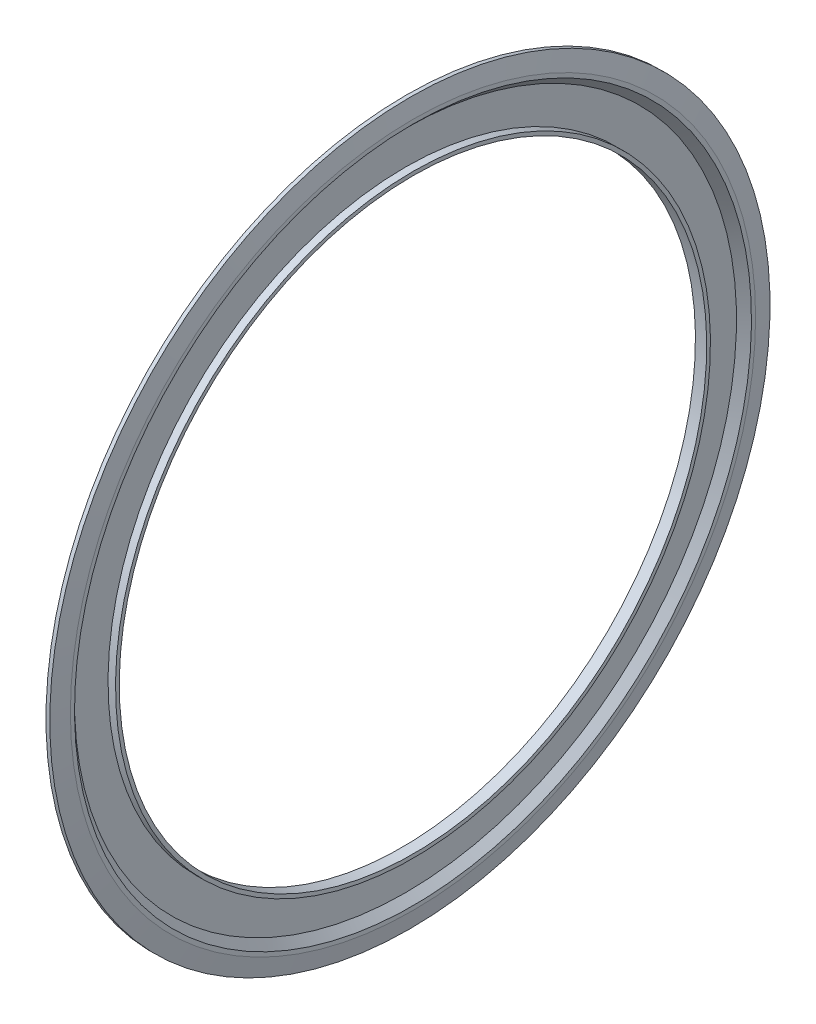
ISO-10303-21;
HEADER;
FILE_DESCRIPTION(('STEP AP214'),'2;1');
FILE_NAME('part.step','',(''),(''),'','','');
FILE_SCHEMA(('AUTOMOTIVE_DESIGN { 1 0 10303 214 1 1 1 1 }'));
ENDSEC;
DATA;
#1=APPLICATION_CONTEXT('core data for automotive mechanical design processes');
#2=APPLICATION_PROTOCOL_DEFINITION('international standard','automotive_design',2000,#1);
#3=PRODUCT_CONTEXT('',#1,'mechanical');
#4=PRODUCT('Part','Part','',(#3));
#5=PRODUCT_RELATED_PRODUCT_CATEGORY('part','',(#4));
#6=PRODUCT_DEFINITION_FORMATION('','',#4);
#7=PRODUCT_DEFINITION_CONTEXT('part definition',#1,'design');
#8=PRODUCT_DEFINITION('design','',#6,#7);
#9=PRODUCT_DEFINITION_SHAPE('','',#8);
#10=(LENGTH_UNIT() NAMED_UNIT(*) SI_UNIT(.MILLI.,.METRE.));
#11=(NAMED_UNIT(*) PLANE_ANGLE_UNIT() SI_UNIT($,.RADIAN.));
#12=(NAMED_UNIT(*) SI_UNIT($,.STERADIAN.) SOLID_ANGLE_UNIT());
#13=UNCERTAINTY_MEASURE_WITH_UNIT(LENGTH_MEASURE(1.E-05),#10,'distance_accuracy_value','');
#14=(GEOMETRIC_REPRESENTATION_CONTEXT(3) GLOBAL_UNCERTAINTY_ASSIGNED_CONTEXT((#13)) GLOBAL_UNIT_ASSIGNED_CONTEXT((#10,
#11,#12)) REPRESENTATION_CONTEXT('',''));
#15=CARTESIAN_POINT('',(0.,0.,0.));
#16=DIRECTION('',(0.,0.,1.));
#17=DIRECTION('',(1.,0.,0.));
#18=AXIS2_PLACEMENT_3D('',#15,#16,#17);
#19=CARTESIAN_POINT('',(0.498800475508444,11.58,0.));
#20=DIRECTION('',(1.,0.,0.));
#21=DIRECTION('',(0.,-1.,0.));
#22=AXIS2_PLACEMENT_3D('',#19,#20,#21);
#23=PLANE('',#22);
#24=CARTESIAN_POINT('',(0.498800475508444,0.,0.));
#25=DIRECTION('',(-1.,0.,0.));
#26=DIRECTION('',(0.,1.,0.));
#27=AXIS2_PLACEMENT_3D('',#24,#25,#26);
#28=CIRCLE('',#27,11.51);
#29=CARTESIAN_POINT('',(0.498800475508444,11.51,0.));
#30=VERTEX_POINT('',#29);
#31=EDGE_CURVE('E11',#30,#30,#28,.T.);
#32=ORIENTED_EDGE('',*,*,#31,.T.);
#33=EDGE_LOOP('',(#32));
#34=FACE_BOUND('',#33,.T.);
#35=CARTESIAN_POINT('',(0.498800475508444,0.,0.));
#36=DIRECTION('',(-1.,0.,0.));
#37=DIRECTION('',(0.,1.,0.));
#38=AXIS2_PLACEMENT_3D('',#35,#36,#37);
#39=CIRCLE('',#38,11.65);
#40=CARTESIAN_POINT('',(0.498800475508444,11.65,0.));
#41=VERTEX_POINT('',#40);
#42=EDGE_CURVE('E20',#41,#41,#39,.T.);
#43=ORIENTED_EDGE('',*,*,#42,.F.);
#44=EDGE_LOOP('',(#43));
#45=FACE_BOUND('',#44,.T.);
#46=ADVANCED_FACE('F16',(#34,#45),#23,.T.);
#47=CARTESIAN_POINT('',(0.371300475508445,0.,0.));
#48=DIRECTION('',(1.,0.,0.));
#49=DIRECTION('',(0.,1.,0.));
#50=AXIS2_PLACEMENT_3D('',#47,#48,#49);
#51=CONICAL_SURFACE('',#50,11.3825,0.785398163397446);
#52=CARTESIAN_POINT('',(0.243800475508445,0.,0.));
#53=DIRECTION('',(-1.,0.,0.));
#54=DIRECTION('',(0.,1.,0.));
#55=AXIS2_PLACEMENT_3D('',#52,#53,#54);
#56=CIRCLE('',#55,11.255);
#57=CARTESIAN_POINT('',(0.243800475508445,11.255,0.));
#58=VERTEX_POINT('',#57);
#59=EDGE_CURVE('E26',#58,#58,#56,.T.);
#60=ORIENTED_EDGE('',*,*,#59,.T.);
#61=EDGE_LOOP('',(#60));
#62=FACE_BOUND('',#61,.T.);
#63=ORIENTED_EDGE('',*,*,#31,.F.);
#64=EDGE_LOOP('',(#63));
#65=FACE_BOUND('',#64,.T.);
#66=ADVANCED_FACE('F18',(#62,#65),#51,.F.);
#67=CARTESIAN_POINT('',(0.243800475508445,10.685,0.));
#68=DIRECTION('',(1.,0.,0.));
#69=DIRECTION('',(0.,-1.,0.));
#70=AXIS2_PLACEMENT_3D('',#67,#68,#69);
#71=PLANE('',#70);
#72=CARTESIAN_POINT('',(0.243800475508445,0.,0.));
#73=DIRECTION('',(-1.,0.,0.));
#74=DIRECTION('',(0.,1.,0.));
#75=AXIS2_PLACEMENT_3D('',#72,#73,#74);
#76=CIRCLE('',#75,10.115);
#77=CARTESIAN_POINT('',(0.243800475508445,10.115,0.));
#78=VERTEX_POINT('',#77);
#79=EDGE_CURVE('E78',#78,#78,#76,.T.);
#80=ORIENTED_EDGE('',*,*,#79,.T.);
#81=EDGE_LOOP('',(#80));
#82=FACE_BOUND('',#81,.T.);
#83=ORIENTED_EDGE('',*,*,#59,.F.);
#84=EDGE_LOOP('',(#83));
#85=FACE_BOUND('',#84,.T.);
#86=ADVANCED_FACE('F99',(#82,#85),#71,.T.);
#87=CARTESIAN_POINT('',(0.371300475508445,0.,0.));
#88=DIRECTION('',(1.,0.,0.));
#89=DIRECTION('',(0.,1.,0.));
#90=AXIS2_PLACEMENT_3D('',#87,#88,#89);
#91=CYLINDRICAL_SURFACE('',#90,10.115);
#92=CARTESIAN_POINT('',(0.498800475508444,0.,0.));
#93=DIRECTION('',(-1.,0.,0.));
#94=DIRECTION('',(0.,1.,0.));
#95=AXIS2_PLACEMENT_3D('',#92,#93,#94);
#96=CIRCLE('',#95,10.115);
#97=CARTESIAN_POINT('',(0.498800475508444,10.115,0.));
#98=VERTEX_POINT('',#97);
#99=EDGE_CURVE('E75',#98,#98,#96,.T.);
#100=ORIENTED_EDGE('',*,*,#99,.T.);
#101=EDGE_LOOP('',(#100));
#102=FACE_BOUND('',#101,.T.);
#103=ORIENTED_EDGE('',*,*,#79,.F.);
#104=EDGE_LOOP('',(#103));
#105=FACE_BOUND('',#104,.T.);
#106=ADVANCED_FACE('F115',(#102,#105),#91,.T.);
#107=CARTESIAN_POINT('',(0.498800475508444,10.05125,0.));
#108=DIRECTION('',(1.,0.,0.));
#109=DIRECTION('',(0.,-1.,0.));
#110=AXIS2_PLACEMENT_3D('',#107,#108,#109);
#111=PLANE('',#110);
#112=CARTESIAN_POINT('',(0.498800475508444,0.,0.));
#113=DIRECTION('',(-1.,0.,0.));
#114=DIRECTION('',(0.,1.,0.));
#115=AXIS2_PLACEMENT_3D('',#112,#113,#114);
#116=CIRCLE('',#115,9.9875);
#117=CARTESIAN_POINT('',(0.498800475508444,9.9875,0.));
#118=VERTEX_POINT('',#117);
#119=EDGE_CURVE('E73',#118,#118,#116,.T.);
#120=ORIENTED_EDGE('',*,*,#119,.T.);
#121=EDGE_LOOP('',(#120));
#122=FACE_BOUND('',#121,.T.);
#123=ORIENTED_EDGE('',*,*,#99,.F.);
#124=EDGE_LOOP('',(#123));
#125=FACE_BOUND('',#124,.T.);
#126=ADVANCED_FACE('F123',(#122,#125),#111,.T.);
#127=CARTESIAN_POINT('',(0.307550475508445,0.,0.));
#128=DIRECTION('',(1.,0.,0.));
#129=DIRECTION('',(0.,1.,0.));
#130=AXIS2_PLACEMENT_3D('',#127,#128,#129);
#131=CYLINDRICAL_SURFACE('',#130,9.9875);
#132=CARTESIAN_POINT('',(0.116300475508445,0.,0.));
#133=DIRECTION('',(-1.,0.,0.));
#134=DIRECTION('',(0.,1.,0.));
#135=AXIS2_PLACEMENT_3D('',#132,#133,#134);
#136=CIRCLE('',#135,9.9875);
#137=CARTESIAN_POINT('',(0.116300475508445,9.9875,0.));
#138=VERTEX_POINT('',#137);
#139=EDGE_CURVE('E71',#138,#138,#136,.T.);
#140=ORIENTED_EDGE('',*,*,#139,.T.);
#141=EDGE_LOOP('',(#140));
#142=FACE_BOUND('',#141,.T.);
#143=ORIENTED_EDGE('',*,*,#119,.F.);
#144=EDGE_LOOP('',(#143));
#145=FACE_BOUND('',#144,.T.);
#146=ADVANCED_FACE('F118',(#142,#145),#131,.F.);
#147=CARTESIAN_POINT('',(0.116300475508446,10.6476561146013,0.));
#148=DIRECTION('',(-1.,0.,0.));
#149=DIRECTION('',(0.,1.,0.));
#150=AXIS2_PLACEMENT_3D('',#147,#148,#149);
#151=PLANE('',#150);
#152=CARTESIAN_POINT('',(0.116300475508446,0.,0.));
#153=DIRECTION('',(-1.,0.,0.));
#154=DIRECTION('',(0.,1.,0.));
#155=AXIS2_PLACEMENT_3D('',#152,#153,#154);
#156=CIRCLE('',#155,11.3078122292026);
#157=CARTESIAN_POINT('',(0.116300475508446,11.3078122292026,0.));
#158=VERTEX_POINT('',#157);
#159=EDGE_CURVE('E128',#158,#158,#156,.T.);
#160=ORIENTED_EDGE('',*,*,#159,.T.);
#161=EDGE_LOOP('',(#160));
#162=FACE_BOUND('',#161,.T.);
#163=ORIENTED_EDGE('',*,*,#139,.F.);
#164=EDGE_LOOP('',(#163));
#165=FACE_BOUND('',#164,.T.);
#166=ADVANCED_FACE('F112',(#162,#165),#151,.T.);
#167=CARTESIAN_POINT('',(0.243800475508445,0.,0.));
#168=DIRECTION('',(1.,0.,0.));
#169=DIRECTION('',(0.,1.,0.));
#170=AXIS2_PLACEMENT_3D('',#167,#168,#169);
#171=CONICAL_SURFACE('',#170,11.4353122292026,0.785398163397449);
#172=CARTESIAN_POINT('',(0.371300475508445,0.,0.));
#173=DIRECTION('',(-1.,0.,0.));
#174=DIRECTION('',(0.,1.,0.));
#175=AXIS2_PLACEMENT_3D('',#172,#173,#174);
#176=CIRCLE('',#175,11.5628122292026);
#177=CARTESIAN_POINT('',(0.371300475508445,11.5628122292026,0.));
#178=VERTEX_POINT('',#177);
#179=EDGE_CURVE('E66',#178,#178,#176,.T.);
#180=ORIENTED_EDGE('',*,*,#179,.T.);
#181=EDGE_LOOP('',(#180));
#182=FACE_BOUND('',#181,.T.);
#183=ORIENTED_EDGE('',*,*,#159,.F.);
#184=EDGE_LOOP('',(#183));
#185=FACE_BOUND('',#184,.T.);
#186=ADVANCED_FACE('F108',(#182,#185),#171,.T.);
#187=CARTESIAN_POINT('',(0.371300475508445,11.6008287123015,0.));
#188=DIRECTION('',(-1.,0.,0.));
#189=DIRECTION('',(0.,1.,0.));
#190=AXIS2_PLACEMENT_3D('',#187,#188,#189);
#191=PLANE('',#190);
#192=CARTESIAN_POINT('',(0.371300475508445,0.,0.));
#193=DIRECTION('',(-1.,0.,0.));
#194=DIRECTION('',(0.,1.,0.));
#195=AXIS2_PLACEMENT_3D('',#192,#193,#194);
#196=CIRCLE('',#195,11.6388451954004);
#197=CARTESIAN_POINT('',(0.371300475508445,11.6388451954004,0.));
#198=VERTEX_POINT('',#197);
#199=EDGE_CURVE('E64',#198,#198,#196,.T.);
#200=ORIENTED_EDGE('',*,*,#199,.T.);
#201=EDGE_LOOP('',(#200));
#202=FACE_BOUND('',#201,.T.);
#203=ORIENTED_EDGE('',*,*,#179,.F.);
#204=EDGE_LOOP('',(#203));
#205=FACE_BOUND('',#204,.T.);
#206=ADVANCED_FACE('F105',(#202,#205),#191,.T.);
#207=CARTESIAN_POINT('',(0.31785975223996,0.,0.));
#208=DIRECTION('',(-1.,0.,0.));
#209=DIRECTION('',(0.,1.,0.));
#210=AXIS2_PLACEMENT_3D('',#207,#208,#209);
#211=CONICAL_SURFACE('',#210,11.9419225977002,1.39626340159546);
#212=CARTESIAN_POINT('',(0.264419028971476,0.,0.));
#213=DIRECTION('',(-1.,0.,0.));
#214=DIRECTION('',(0.,1.,0.));
#215=AXIS2_PLACEMENT_3D('',#212,#213,#214);
#216=CIRCLE('',#215,12.245);
#217=CARTESIAN_POINT('',(0.264419028971476,12.245,0.));
#218=VERTEX_POINT('',#217);
#219=EDGE_CURVE('E60',#218,#218,#216,.T.);
#220=ORIENTED_EDGE('',*,*,#219,.T.);
#221=EDGE_LOOP('',(#220));
#222=FACE_BOUND('',#221,.T.);
#223=ORIENTED_EDGE('',*,*,#199,.F.);
#224=EDGE_LOOP('',(#223));
#225=FACE_BOUND('',#224,.T.);
#226=ADVANCED_FACE('F61',(#222,#225),#211,.F.);
#227=CARTESIAN_POINT('',(0.329152475479191,0.,0.));
#228=DIRECTION('',(1.,0.,0.));
#229=DIRECTION('',(0.,1.,0.));
#230=AXIS2_PLACEMENT_3D('',#227,#228,#229);
#231=CYLINDRICAL_SURFACE('',#230,12.245);
#232=CARTESIAN_POINT('',(0.393885921986908,0.,0.));
#233=DIRECTION('',(-1.,0.,0.));
#234=DIRECTION('',(0.,1.,0.));
#235=AXIS2_PLACEMENT_3D('',#232,#233,#234);
#236=CIRCLE('',#235,12.245);
#237=CARTESIAN_POINT('',(0.393885921986908,12.245,0.));
#238=VERTEX_POINT('',#237);
#239=EDGE_CURVE('E68',#238,#238,#236,.T.);
#240=ORIENTED_EDGE('',*,*,#239,.T.);
#241=EDGE_LOOP('',(#240));
#242=FACE_BOUND('',#241,.T.);
#243=ORIENTED_EDGE('',*,*,#219,.F.);
#244=EDGE_LOOP('',(#243));
#245=FACE_BOUND('',#244,.T.);
#246=ADVANCED_FACE('F82',(#242,#245),#231,.T.);
#247=CARTESIAN_POINT('',(0.446343198747676,0.,0.));
#248=DIRECTION('',(-1.,0.,0.));
#249=DIRECTION('',(0.,1.,0.));
#250=AXIS2_PLACEMENT_3D('',#247,#248,#249);
#251=CONICAL_SURFACE('',#250,11.9475,1.39626340159546);
#252=ORIENTED_EDGE('',*,*,#42,.T.);
#253=EDGE_LOOP('',(#252));
#254=FACE_BOUND('',#253,.T.);
#255=ORIENTED_EDGE('',*,*,#239,.F.);
#256=EDGE_LOOP('',(#255));
#257=FACE_BOUND('',#256,.T.);
#258=ADVANCED_FACE('F84',(#254,#257),#251,.T.);
#259=CLOSED_SHELL('',(#46,#66,#86,#106,#126,#146,#166,#186,#206,#226,#246,#258));
#260=MANIFOLD_SOLID_BREP('B1',#259);
#261=ADVANCED_BREP_SHAPE_REPRESENTATION('',(#18,#260),#14);
#262=SHAPE_DEFINITION_REPRESENTATION(#9,#261);
ENDSEC;
END-ISO-10303-21;
